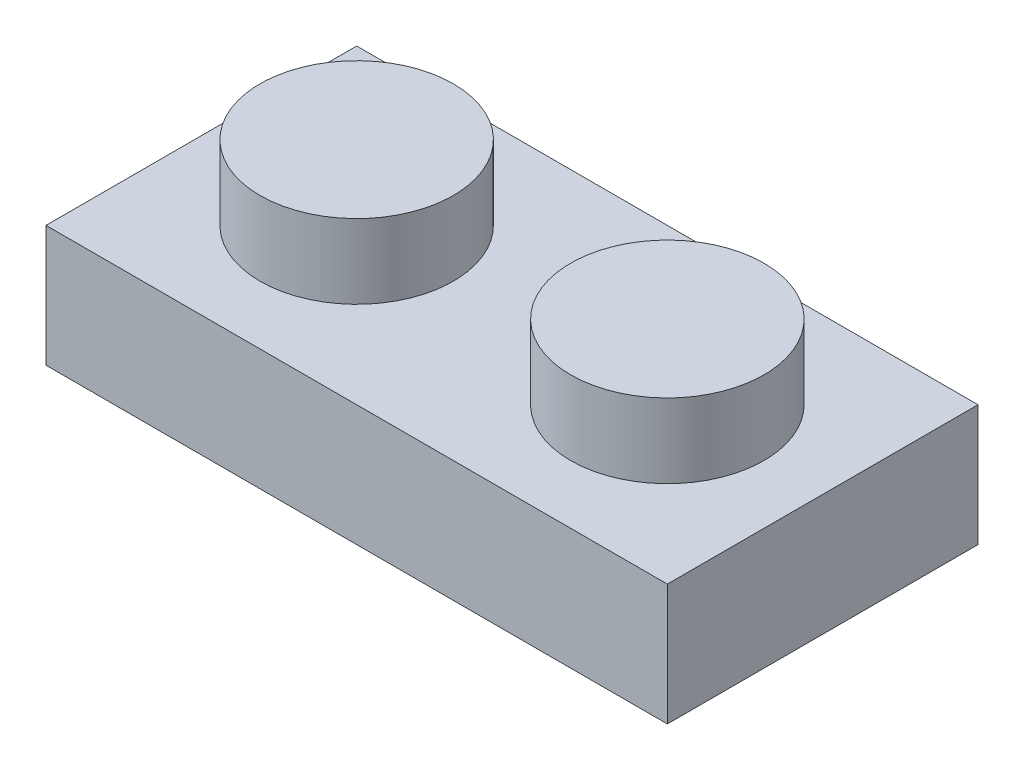
ISO-10303-21;
HEADER;
FILE_DESCRIPTION(('STEP AP214'),'2;1');
FILE_NAME('part.step','',(''),(''),'','','');
FILE_SCHEMA(('AUTOMOTIVE_DESIGN { 1 0 10303 214 1 1 1 1 }'));
ENDSEC;
DATA;
#1=APPLICATION_CONTEXT('core data for automotive mechanical design processes');
#2=APPLICATION_PROTOCOL_DEFINITION('international standard','automotive_design',2000,#1);
#3=PRODUCT_CONTEXT('',#1,'mechanical');
#4=PRODUCT('Part','Part','',(#3));
#5=PRODUCT_RELATED_PRODUCT_CATEGORY('part','',(#4));
#6=PRODUCT_DEFINITION_FORMATION('','',#4);
#7=PRODUCT_DEFINITION_CONTEXT('part definition',#1,'design');
#8=PRODUCT_DEFINITION('design','',#6,#7);
#9=PRODUCT_DEFINITION_SHAPE('','',#8);
#10=(LENGTH_UNIT() NAMED_UNIT(*) SI_UNIT(.MILLI.,.METRE.));
#11=(NAMED_UNIT(*) PLANE_ANGLE_UNIT() SI_UNIT($,.RADIAN.));
#12=(NAMED_UNIT(*) SI_UNIT($,.STERADIAN.) SOLID_ANGLE_UNIT());
#13=UNCERTAINTY_MEASURE_WITH_UNIT(LENGTH_MEASURE(1.E-05),#10,'distance_accuracy_value','');
#14=(GEOMETRIC_REPRESENTATION_CONTEXT(3) GLOBAL_UNCERTAINTY_ASSIGNED_CONTEXT((#13)) GLOBAL_UNIT_ASSIGNED_CONTEXT((#10,
#11,#12)) REPRESENTATION_CONTEXT('',''));
#15=CARTESIAN_POINT('',(0.,0.,0.));
#16=DIRECTION('',(0.,0.,1.));
#17=DIRECTION('',(1.,0.,0.));
#18=AXIS2_PLACEMENT_3D('',#15,#16,#17);
#19=CARTESIAN_POINT('',(-49.2534841215444,3.1,6.12242403472698));
#20=DIRECTION('',(0.,1.,0.));
#21=DIRECTION('',(0.,0.,1.));
#22=AXIS2_PLACEMENT_3D('',#19,#20,#21);
#23=PLANE('',#22);
#24=CARTESIAN_POINT('',(-45.2784841215445,3.1,10.097424034727));
#25=DIRECTION('',(0.,1.,0.));
#26=DIRECTION('',(0.,0.,1.));
#27=AXIS2_PLACEMENT_3D('',#24,#25,#26);
#28=CIRCLE('',#27,2.475);
#29=CARTESIAN_POINT('',(-45.2784841215445,3.1,7.62242403472699));
#30=VERTEX_POINT('',#29);
#31=EDGE_CURVE('E148',#30,#30,#28,.T.);
#32=ORIENTED_EDGE('',*,*,#31,.F.);
#33=EDGE_LOOP('',(#32));
#34=FACE_BOUND('',#33,.T.);
#35=DIRECTION('',(-1.,0.,0.));
#36=VECTOR('',#35,1.);
#37=CARTESIAN_POINT('',(-33.3534841215445,3.1,6.12242403472698));
#38=LINE('',#37,#36);
#39=CARTESIAN_POINT('',(-33.3534841215445,3.1,6.12242403472698));
#40=VERTEX_POINT('',#39);
#41=CARTESIAN_POINT('',(-49.2534841215444,3.1,6.12242403472698));
#42=VERTEX_POINT('',#41);
#43=EDGE_CURVE('E157',#40,#42,#38,.T.);
#44=ORIENTED_EDGE('',*,*,#43,.T.);
#45=DIRECTION('',(0.,0.,1.));
#46=VECTOR('',#45,1.);
#47=CARTESIAN_POINT('',(-49.2534841215444,3.1,6.12242403472698));
#48=LINE('',#47,#46);
#49=CARTESIAN_POINT('',(-49.2534841215445,3.1,14.072424034727));
#50=VERTEX_POINT('',#49);
#51=EDGE_CURVE('E84',#42,#50,#48,.T.);
#52=ORIENTED_EDGE('',*,*,#51,.T.);
#53=DIRECTION('',(1.,0.,0.));
#54=VECTOR('',#53,1.);
#55=CARTESIAN_POINT('',(-49.2534841215445,3.1,14.072424034727));
#56=LINE('',#55,#54);
#57=CARTESIAN_POINT('',(-33.3534841215445,3.1,14.072424034727));
#58=VERTEX_POINT('',#57);
#59=EDGE_CURVE('E160',#50,#58,#56,.T.);
#60=ORIENTED_EDGE('',*,*,#59,.T.);
#61=DIRECTION('',(0.,0.,-1.));
#62=VECTOR('',#61,1.);
#63=CARTESIAN_POINT('',(-33.3534841215445,3.1,14.072424034727));
#64=LINE('',#63,#62);
#65=EDGE_CURVE('E56',#58,#40,#64,.T.);
#66=ORIENTED_EDGE('',*,*,#65,.T.);
#67=EDGE_LOOP('',(#44,#52,#60,#66));
#68=FACE_BOUND('',#67,.T.);
#69=CARTESIAN_POINT('',(-37.3284841215445,3.1,10.097424034727));
#70=DIRECTION('',(0.,1.,0.));
#71=DIRECTION('',(0.,0.,1.));
#72=AXIS2_PLACEMENT_3D('',#69,#70,#71);
#73=CIRCLE('',#72,2.475);
#74=CARTESIAN_POINT('',(-37.3284841215445,3.1,7.62242403472699));
#75=VERTEX_POINT('',#74);
#76=EDGE_CURVE('E141',#75,#75,#73,.T.);
#77=ORIENTED_EDGE('',*,*,#76,.F.);
#78=EDGE_LOOP('',(#77));
#79=FACE_BOUND('',#78,.T.);
#80=ADVANCED_FACE('F32',(#34,#68,#79),#23,.T.);
#81=CARTESIAN_POINT('',(-33.3534841215445,3.1,6.12242403472698));
#82=DIRECTION('',(0.,0.,1.));
#83=DIRECTION('',(1.,0.,0.));
#84=AXIS2_PLACEMENT_3D('',#81,#82,#83);
#85=PLANE('',#84);
#86=DIRECTION('',(-1.,0.,0.));
#87=VECTOR('',#86,1.);
#88=CARTESIAN_POINT('',(-33.3534841215445,0.,6.12242403472698));
#89=LINE('',#88,#87);
#90=CARTESIAN_POINT('',(-33.3534841215445,0.,6.12242403472698));
#91=VERTEX_POINT('',#90);
#92=CARTESIAN_POINT('',(-49.2534841215444,0.,6.12242403472698));
#93=VERTEX_POINT('',#92);
#94=EDGE_CURVE('E154',#91,#93,#89,.T.);
#95=ORIENTED_EDGE('',*,*,#94,.T.);
#96=DIRECTION('',(0.,-1.,0.));
#97=VECTOR('',#96,1.);
#98=CARTESIAN_POINT('',(-49.2534841215444,3.1,6.12242403472698));
#99=LINE('',#98,#97);
#100=EDGE_CURVE('E11',#42,#93,#99,.T.);
#101=ORIENTED_EDGE('',*,*,#100,.F.);
#102=ORIENTED_EDGE('',*,*,#43,.F.);
#103=DIRECTION('',(0.,-1.,0.));
#104=VECTOR('',#103,1.);
#105=CARTESIAN_POINT('',(-33.3534841215445,3.1,6.12242403472698));
#106=LINE('',#105,#104);
#107=EDGE_CURVE('E163',#40,#91,#106,.T.);
#108=ORIENTED_EDGE('',*,*,#107,.T.);
#109=EDGE_LOOP('',(#95,#101,#102,#108));
#110=FACE_BOUND('',#109,.T.);
#111=ADVANCED_FACE('F34',(#110),#85,.F.);
#112=CARTESIAN_POINT('',(-49.2534841215444,3.1,6.12242403472698));
#113=DIRECTION('',(1.,0.,0.));
#114=DIRECTION('',(0.,0.,-1.));
#115=AXIS2_PLACEMENT_3D('',#112,#113,#114);
#116=PLANE('',#115);
#117=DIRECTION('',(0.,0.,1.));
#118=VECTOR('',#117,1.);
#119=CARTESIAN_POINT('',(-49.2534841215444,0.,6.12242403472698));
#120=LINE('',#119,#118);
#121=CARTESIAN_POINT('',(-49.2534841215445,0.,14.072424034727));
#122=VERTEX_POINT('',#121);
#123=EDGE_CURVE('E166',#93,#122,#120,.T.);
#124=ORIENTED_EDGE('',*,*,#123,.T.);
#125=DIRECTION('',(0.,-1.,0.));
#126=VECTOR('',#125,1.);
#127=CARTESIAN_POINT('',(-49.2534841215445,3.1,14.072424034727));
#128=LINE('',#127,#126);
#129=EDGE_CURVE('E40',#50,#122,#128,.T.);
#130=ORIENTED_EDGE('',*,*,#129,.F.);
#131=ORIENTED_EDGE('',*,*,#51,.F.);
#132=ORIENTED_EDGE('',*,*,#100,.T.);
#133=EDGE_LOOP('',(#124,#130,#131,#132));
#134=FACE_BOUND('',#133,.T.);
#135=ADVANCED_FACE('F195',(#134),#116,.F.);
#136=CARTESIAN_POINT('',(-49.2534841215445,3.1,14.072424034727));
#137=DIRECTION('',(0.,0.,-1.));
#138=DIRECTION('',(-1.,0.,0.));
#139=AXIS2_PLACEMENT_3D('',#136,#137,#138);
#140=PLANE('',#139);
#141=DIRECTION('',(1.,0.,0.));
#142=VECTOR('',#141,1.);
#143=CARTESIAN_POINT('',(-49.2534841215445,0.,14.072424034727));
#144=LINE('',#143,#142);
#145=CARTESIAN_POINT('',(-33.3534841215445,0.,14.072424034727));
#146=VERTEX_POINT('',#145);
#147=EDGE_CURVE('E168',#122,#146,#144,.T.);
#148=ORIENTED_EDGE('',*,*,#147,.T.);
#149=DIRECTION('',(0.,-1.,0.));
#150=VECTOR('',#149,1.);
#151=CARTESIAN_POINT('',(-33.3534841215445,3.1,14.072424034727));
#152=LINE('',#151,#150);
#153=EDGE_CURVE('E172',#58,#146,#152,.T.);
#154=ORIENTED_EDGE('',*,*,#153,.F.);
#155=ORIENTED_EDGE('',*,*,#59,.F.);
#156=ORIENTED_EDGE('',*,*,#129,.T.);
#157=EDGE_LOOP('',(#148,#154,#155,#156));
#158=FACE_BOUND('',#157,.T.);
#159=ADVANCED_FACE('F177',(#158),#140,.F.);
#160=CARTESIAN_POINT('',(-33.3534841215445,3.1,14.072424034727));
#161=DIRECTION('',(-1.,0.,0.));
#162=DIRECTION('',(0.,0.,1.));
#163=AXIS2_PLACEMENT_3D('',#160,#161,#162);
#164=PLANE('',#163);
#165=DIRECTION('',(0.,0.,-1.));
#166=VECTOR('',#165,1.);
#167=CARTESIAN_POINT('',(-33.3534841215445,0.,14.072424034727));
#168=LINE('',#167,#166);
#169=EDGE_CURVE('E77',#146,#91,#168,.T.);
#170=ORIENTED_EDGE('',*,*,#169,.T.);
#171=ORIENTED_EDGE('',*,*,#107,.F.);
#172=ORIENTED_EDGE('',*,*,#65,.F.);
#173=ORIENTED_EDGE('',*,*,#153,.T.);
#174=EDGE_LOOP('',(#170,#171,#172,#173));
#175=FACE_BOUND('',#174,.T.);
#176=ADVANCED_FACE('F185',(#175),#164,.F.);
#177=CARTESIAN_POINT('',(-49.2534841215444,0.,6.12242403472698));
#178=DIRECTION('',(0.,1.,0.));
#179=DIRECTION('',(0.,0.,1.));
#180=AXIS2_PLACEMENT_3D('',#177,#178,#179);
#181=PLANE('',#180);
#182=DIRECTION('',(1.,0.,0.));
#183=VECTOR('',#182,1.);
#184=CARTESIAN_POINT('',(-34.8534841215445,0.,7.62242403472698));
#185=LINE('',#184,#183);
#186=CARTESIAN_POINT('',(-47.7534841215444,0.,7.62242403472698));
#187=VERTEX_POINT('',#186);
#188=CARTESIAN_POINT('',(-34.8534841215445,0.,7.62242403472698));
#189=VERTEX_POINT('',#188);
#190=EDGE_CURVE('E135',#187,#189,#185,.T.);
#191=ORIENTED_EDGE('',*,*,#190,.F.);
#192=DIRECTION('',(0.,0.,-1.));
#193=VECTOR('',#192,1.);
#194=CARTESIAN_POINT('',(-47.7534841215444,0.,7.62242403472698));
#195=LINE('',#194,#193);
#196=CARTESIAN_POINT('',(-47.7534841215444,0.,12.572424034727));
#197=VERTEX_POINT('',#196);
#198=EDGE_CURVE('E47',#197,#187,#195,.T.);
#199=ORIENTED_EDGE('',*,*,#198,.F.);
#200=DIRECTION('',(-1.,0.,0.));
#201=VECTOR('',#200,1.);
#202=CARTESIAN_POINT('',(-47.7534841215444,0.,12.572424034727));
#203=LINE('',#202,#201);
#204=CARTESIAN_POINT('',(-34.8534841215445,0.,12.572424034727));
#205=VERTEX_POINT('',#204);
#206=EDGE_CURVE('E126',#205,#197,#203,.T.);
#207=ORIENTED_EDGE('',*,*,#206,.F.);
#208=DIRECTION('',(0.,0.,1.));
#209=VECTOR('',#208,1.);
#210=CARTESIAN_POINT('',(-34.8534841215445,0.,12.572424034727));
#211=LINE('',#210,#209);
#212=EDGE_CURVE('E129',#189,#205,#211,.T.);
#213=ORIENTED_EDGE('',*,*,#212,.F.);
#214=EDGE_LOOP('',(#191,#199,#207,#213));
#215=FACE_BOUND('',#214,.T.);
#216=ORIENTED_EDGE('',*,*,#94,.F.);
#217=ORIENTED_EDGE('',*,*,#169,.F.);
#218=ORIENTED_EDGE('',*,*,#147,.F.);
#219=ORIENTED_EDGE('',*,*,#123,.F.);
#220=EDGE_LOOP('',(#216,#217,#218,#219));
#221=FACE_BOUND('',#220,.T.);
#222=ADVANCED_FACE('F181',(#215,#221),#181,.F.);
#223=CARTESIAN_POINT('',(-45.2784841215445,5.,10.097424034727));
#224=DIRECTION('',(0.,-1.,0.));
#225=DIRECTION('',(0.,0.,-1.));
#226=AXIS2_PLACEMENT_3D('',#223,#224,#225);
#227=CYLINDRICAL_SURFACE('',#226,2.475);
#228=CARTESIAN_POINT('',(-45.2784841215445,5.,10.097424034727));
#229=DIRECTION('',(0.,1.,0.));
#230=DIRECTION('',(0.,0.,1.));
#231=AXIS2_PLACEMENT_3D('',#228,#229,#230);
#232=CIRCLE('',#231,2.475);
#233=CARTESIAN_POINT('',(-45.2784841215445,5.,7.62242403472699));
#234=VERTEX_POINT('',#233);
#235=EDGE_CURVE('E151',#234,#234,#232,.T.);
#236=CARTESIAN_POINT('',(-45.2784841215445,5.,7.62242403472699));
#237=CARTESIAN_POINT('',(-45.2784841215445,4.98020833333333,7.62242403472699));
#238=CARTESIAN_POINT('',(-45.2784841215445,4.96041666666667,7.62242403472699));
#239=CARTESIAN_POINT('',(-45.2784841215445,4.92083333333333,7.62242403472699));
#240=CARTESIAN_POINT('',(-45.2784841215445,4.90104166666667,7.62242403472699));
#241=CARTESIAN_POINT('',(-45.2784841215445,4.86145833333333,7.62242403472699));
#242=CARTESIAN_POINT('',(-45.2784841215445,4.84166666666667,7.62242403472699));
#243=CARTESIAN_POINT('',(-45.2784841215445,4.80208333333333,7.62242403472699));
#244=CARTESIAN_POINT('',(-45.2784841215445,4.78229166666667,7.62242403472699));
#245=CARTESIAN_POINT('',(-45.2784841215445,4.74270833333333,7.62242403472699));
#246=CARTESIAN_POINT('',(-45.2784841215445,4.72291666666667,7.62242403472699));
#247=CARTESIAN_POINT('',(-45.2784841215445,4.68333333333333,7.62242403472699));
#248=CARTESIAN_POINT('',(-45.2784841215445,4.66354166666667,7.62242403472699));
#249=CARTESIAN_POINT('',(-45.2784841215445,4.62395833333333,7.62242403472699));
#250=CARTESIAN_POINT('',(-45.2784841215445,4.60416666666667,7.62242403472699));
#251=CARTESIAN_POINT('',(-45.2784841215445,4.56458333333333,7.62242403472699));
#252=CARTESIAN_POINT('',(-45.2784841215445,4.54479166666667,7.62242403472699));
#253=CARTESIAN_POINT('',(-45.2784841215445,4.50520833333333,7.62242403472699));
#254=CARTESIAN_POINT('',(-45.2784841215445,4.48541666666667,7.62242403472699));
#255=CARTESIAN_POINT('',(-45.2784841215445,4.44583333333333,7.62242403472699));
#256=CARTESIAN_POINT('',(-45.2784841215445,4.42604166666667,7.62242403472699));
#257=CARTESIAN_POINT('',(-45.2784841215445,4.38645833333333,7.62242403472699));
#258=CARTESIAN_POINT('',(-45.2784841215445,4.36666666666667,7.62242403472699));
#259=CARTESIAN_POINT('',(-45.2784841215445,4.32708333333333,7.62242403472699));
#260=CARTESIAN_POINT('',(-45.2784841215445,4.30729166666667,7.62242403472699));
#261=CARTESIAN_POINT('',(-45.2784841215445,4.26770833333333,7.62242403472699));
#262=CARTESIAN_POINT('',(-45.2784841215445,4.24791666666667,7.62242403472699));
#263=CARTESIAN_POINT('',(-45.2784841215445,4.20833333333333,7.62242403472699));
#264=CARTESIAN_POINT('',(-45.2784841215445,4.18854166666667,7.62242403472699));
#265=CARTESIAN_POINT('',(-45.2784841215445,4.14895833333333,7.62242403472699));
#266=CARTESIAN_POINT('',(-45.2784841215445,4.12916666666667,7.62242403472699));
#267=CARTESIAN_POINT('',(-45.2784841215445,4.08958333333333,7.62242403472699));
#268=CARTESIAN_POINT('',(-45.2784841215445,4.06979166666667,7.62242403472699));
#269=CARTESIAN_POINT('',(-45.2784841215445,4.03020833333333,7.62242403472699));
#270=CARTESIAN_POINT('',(-45.2784841215445,4.01041666666667,7.62242403472699));
#271=CARTESIAN_POINT('',(-45.2784841215445,3.97083333333333,7.62242403472699));
#272=CARTESIAN_POINT('',(-45.2784841215445,3.95104166666667,7.62242403472699));
#273=CARTESIAN_POINT('',(-45.2784841215445,3.91145833333333,7.62242403472699));
#274=CARTESIAN_POINT('',(-45.2784841215445,3.89166666666667,7.62242403472699));
#275=CARTESIAN_POINT('',(-45.2784841215445,3.85208333333333,7.62242403472699));
#276=CARTESIAN_POINT('',(-45.2784841215445,3.83229166666667,7.62242403472699));
#277=CARTESIAN_POINT('',(-45.2784841215445,3.79270833333333,7.62242403472699));
#278=CARTESIAN_POINT('',(-45.2784841215445,3.77291666666667,7.62242403472699));
#279=CARTESIAN_POINT('',(-45.2784841215445,3.73333333333333,7.62242403472699));
#280=CARTESIAN_POINT('',(-45.2784841215445,3.71354166666667,7.62242403472699));
#281=CARTESIAN_POINT('',(-45.2784841215445,3.67395833333333,7.62242403472699));
#282=CARTESIAN_POINT('',(-45.2784841215445,3.65416666666667,7.62242403472699));
#283=CARTESIAN_POINT('',(-45.2784841215445,3.61458333333333,7.62242403472699));
#284=CARTESIAN_POINT('',(-45.2784841215445,3.59479166666667,7.62242403472699));
#285=CARTESIAN_POINT('',(-45.2784841215445,3.55520833333333,7.62242403472699));
#286=CARTESIAN_POINT('',(-45.2784841215445,3.53541666666667,7.62242403472699));
#287=CARTESIAN_POINT('',(-45.2784841215445,3.49583333333333,7.62242403472699));
#288=CARTESIAN_POINT('',(-45.2784841215445,3.47604166666667,7.62242403472699));
#289=CARTESIAN_POINT('',(-45.2784841215445,3.43645833333333,7.62242403472699));
#290=CARTESIAN_POINT('',(-45.2784841215445,3.41666666666667,7.62242403472699));
#291=CARTESIAN_POINT('',(-45.2784841215445,3.37708333333333,7.62242403472699));
#292=CARTESIAN_POINT('',(-45.2784841215445,3.35729166666667,7.62242403472699));
#293=CARTESIAN_POINT('',(-45.2784841215445,3.31770833333333,7.62242403472699));
#294=CARTESIAN_POINT('',(-45.2784841215445,3.29791666666667,7.62242403472699));
#295=CARTESIAN_POINT('',(-45.2784841215445,3.25833333333333,7.62242403472699));
#296=CARTESIAN_POINT('',(-45.2784841215445,3.23854166666667,7.62242403472699));
#297=CARTESIAN_POINT('',(-45.2784841215445,3.19895833333333,7.62242403472699));
#298=CARTESIAN_POINT('',(-45.2784841215445,3.17916666666667,7.62242403472699));
#299=CARTESIAN_POINT('',(-45.2784841215445,3.13958333333333,7.62242403472699));
#300=CARTESIAN_POINT('',(-45.2784841215445,3.11979166666667,7.62242403472699));
#301=CARTESIAN_POINT('',(-45.2784841215445,3.1,7.62242403472699));
#302=B_SPLINE_CURVE_WITH_KNOTS('',3,(#236,#237,#238,#239,#240,#241,#242,#243,#244,#245,#246,
#247,#248,#249,#250,#251,#252,#253,#254,#255,#256,#257,#258,#259,#260,#261,#262,#263,#264,#265,
#266,#267,#268,#269,#270,#271,#272,#273,#274,#275,#276,#277,#278,#279,#280,#281,#282,#283,#284,
#285,#286,#287,#288,#289,#290,#291,#292,#293,#294,#295,#296,#297,#298,#299,#300,#301),
.UNSPECIFIED.,.F.,.F.,(4,2,2,2,2,2,2,2,2,2,2,2,2,2,2,2,2,2,2,2,2,2,2,2,2,2,2,2,2,2,2,2,4),(0.,
0.0593750000000004,0.118750000000001,0.178125,0.237500000000001,0.296875,0.356250000000001,
0.415625,0.475000000000001,0.534375,0.593750000000001,0.653125,0.7125,0.771875000000001,0.83125,
0.890625000000001,0.95,1.009375,1.06875,1.128125,1.1875,1.246875,1.30625,1.365625,1.425,
1.484375,1.54375,1.603125,1.6625,1.721875,1.78125,1.840625,1.9),.UNSPECIFIED.);
#303=EDGE_CURVE('BSEAM192',#234,#30,#302,.T.);
#304=ORIENTED_EDGE('',*,*,#235,.F.);
#305=ORIENTED_EDGE('',*,*,#31,.T.);
#306=ORIENTED_EDGE('',*,*,#303,.T.);
#307=ORIENTED_EDGE('',*,*,#303,.F.);
#308=EDGE_LOOP('',(#304,#306,#305,#307));
#309=FACE_BOUND('',#308,.T.);
#310=ADVANCED_FACE('F192',(#309),#227,.T.);
#311=CARTESIAN_POINT('',(-45.2784841215445,5.,10.097424034727));
#312=DIRECTION('',(0.,1.,0.));
#313=DIRECTION('',(0.,0.,1.));
#314=AXIS2_PLACEMENT_3D('',#311,#312,#313);
#315=PLANE('',#314);
#316=ORIENTED_EDGE('',*,*,#235,.T.);
#317=EDGE_LOOP('',(#316));
#318=FACE_BOUND('',#317,.T.);
#319=ADVANCED_FACE('F207',(#318),#315,.T.);
#320=CARTESIAN_POINT('',(-37.3284841215445,5.,10.097424034727));
#321=DIRECTION('',(0.,-1.,0.));
#322=DIRECTION('',(0.,0.,-1.));
#323=AXIS2_PLACEMENT_3D('',#320,#321,#322);
#324=CYLINDRICAL_SURFACE('',#323,2.475);
#325=CARTESIAN_POINT('',(-37.3284841215445,5.,10.097424034727));
#326=DIRECTION('',(0.,1.,0.));
#327=DIRECTION('',(0.,0.,1.));
#328=AXIS2_PLACEMENT_3D('',#325,#326,#327);
#329=CIRCLE('',#328,2.475);
#330=CARTESIAN_POINT('',(-37.3284841215445,5.,7.62242403472699));
#331=VERTEX_POINT('',#330);
#332=EDGE_CURVE('E145',#331,#331,#329,.T.);
#333=CARTESIAN_POINT('',(-37.3284841215445,5.,7.62242403472699));
#334=CARTESIAN_POINT('',(-37.3284841215445,4.98020833333333,7.62242403472699));
#335=CARTESIAN_POINT('',(-37.3284841215445,4.96041666666667,7.62242403472699));
#336=CARTESIAN_POINT('',(-37.3284841215445,4.92083333333333,7.62242403472699));
#337=CARTESIAN_POINT('',(-37.3284841215445,4.90104166666667,7.62242403472699));
#338=CARTESIAN_POINT('',(-37.3284841215445,4.86145833333333,7.62242403472699));
#339=CARTESIAN_POINT('',(-37.3284841215445,4.84166666666667,7.62242403472699));
#340=CARTESIAN_POINT('',(-37.3284841215445,4.80208333333333,7.62242403472699));
#341=CARTESIAN_POINT('',(-37.3284841215445,4.78229166666667,7.62242403472699));
#342=CARTESIAN_POINT('',(-37.3284841215445,4.74270833333333,7.62242403472699));
#343=CARTESIAN_POINT('',(-37.3284841215445,4.72291666666667,7.62242403472699));
#344=CARTESIAN_POINT('',(-37.3284841215445,4.68333333333333,7.62242403472699));
#345=CARTESIAN_POINT('',(-37.3284841215445,4.66354166666667,7.62242403472699));
#346=CARTESIAN_POINT('',(-37.3284841215445,4.62395833333333,7.62242403472699));
#347=CARTESIAN_POINT('',(-37.3284841215445,4.60416666666667,7.62242403472699));
#348=CARTESIAN_POINT('',(-37.3284841215445,4.56458333333333,7.62242403472699));
#349=CARTESIAN_POINT('',(-37.3284841215445,4.54479166666667,7.62242403472699));
#350=CARTESIAN_POINT('',(-37.3284841215445,4.50520833333333,7.62242403472699));
#351=CARTESIAN_POINT('',(-37.3284841215445,4.48541666666667,7.62242403472699));
#352=CARTESIAN_POINT('',(-37.3284841215445,4.44583333333333,7.62242403472699));
#353=CARTESIAN_POINT('',(-37.3284841215445,4.42604166666667,7.62242403472699));
#354=CARTESIAN_POINT('',(-37.3284841215445,4.38645833333333,7.62242403472699));
#355=CARTESIAN_POINT('',(-37.3284841215445,4.36666666666667,7.62242403472699));
#356=CARTESIAN_POINT('',(-37.3284841215445,4.32708333333333,7.62242403472699));
#357=CARTESIAN_POINT('',(-37.3284841215445,4.30729166666667,7.62242403472699));
#358=CARTESIAN_POINT('',(-37.3284841215445,4.26770833333333,7.62242403472699));
#359=CARTESIAN_POINT('',(-37.3284841215445,4.24791666666667,7.62242403472699));
#360=CARTESIAN_POINT('',(-37.3284841215445,4.20833333333333,7.62242403472699));
#361=CARTESIAN_POINT('',(-37.3284841215445,4.18854166666667,7.62242403472699));
#362=CARTESIAN_POINT('',(-37.3284841215445,4.14895833333333,7.62242403472699));
#363=CARTESIAN_POINT('',(-37.3284841215445,4.12916666666667,7.62242403472699));
#364=CARTESIAN_POINT('',(-37.3284841215445,4.08958333333333,7.62242403472699));
#365=CARTESIAN_POINT('',(-37.3284841215445,4.06979166666667,7.62242403472699));
#366=CARTESIAN_POINT('',(-37.3284841215445,4.03020833333333,7.62242403472699));
#367=CARTESIAN_POINT('',(-37.3284841215445,4.01041666666667,7.62242403472699));
#368=CARTESIAN_POINT('',(-37.3284841215445,3.97083333333333,7.62242403472699));
#369=CARTESIAN_POINT('',(-37.3284841215445,3.95104166666667,7.62242403472699));
#370=CARTESIAN_POINT('',(-37.3284841215445,3.91145833333333,7.62242403472699));
#371=CARTESIAN_POINT('',(-37.3284841215445,3.89166666666667,7.62242403472699));
#372=CARTESIAN_POINT('',(-37.3284841215445,3.85208333333333,7.62242403472699));
#373=CARTESIAN_POINT('',(-37.3284841215445,3.83229166666667,7.62242403472699));
#374=CARTESIAN_POINT('',(-37.3284841215445,3.79270833333333,7.62242403472699));
#375=CARTESIAN_POINT('',(-37.3284841215445,3.77291666666667,7.62242403472699));
#376=CARTESIAN_POINT('',(-37.3284841215445,3.73333333333333,7.62242403472699));
#377=CARTESIAN_POINT('',(-37.3284841215445,3.71354166666667,7.62242403472699));
#378=CARTESIAN_POINT('',(-37.3284841215445,3.67395833333333,7.62242403472699));
#379=CARTESIAN_POINT('',(-37.3284841215445,3.65416666666667,7.62242403472699));
#380=CARTESIAN_POINT('',(-37.3284841215445,3.61458333333333,7.62242403472699));
#381=CARTESIAN_POINT('',(-37.3284841215445,3.59479166666667,7.62242403472699));
#382=CARTESIAN_POINT('',(-37.3284841215445,3.55520833333333,7.62242403472699));
#383=CARTESIAN_POINT('',(-37.3284841215445,3.53541666666667,7.62242403472699));
#384=CARTESIAN_POINT('',(-37.3284841215445,3.49583333333333,7.62242403472699));
#385=CARTESIAN_POINT('',(-37.3284841215445,3.47604166666667,7.62242403472699));
#386=CARTESIAN_POINT('',(-37.3284841215445,3.43645833333333,7.62242403472699));
#387=CARTESIAN_POINT('',(-37.3284841215445,3.41666666666667,7.62242403472699));
#388=CARTESIAN_POINT('',(-37.3284841215445,3.37708333333333,7.62242403472699));
#389=CARTESIAN_POINT('',(-37.3284841215445,3.35729166666667,7.62242403472699));
#390=CARTESIAN_POINT('',(-37.3284841215445,3.31770833333333,7.62242403472699));
#391=CARTESIAN_POINT('',(-37.3284841215445,3.29791666666667,7.62242403472699));
#392=CARTESIAN_POINT('',(-37.3284841215445,3.25833333333333,7.62242403472699));
#393=CARTESIAN_POINT('',(-37.3284841215445,3.23854166666667,7.62242403472699));
#394=CARTESIAN_POINT('',(-37.3284841215445,3.19895833333333,7.62242403472699));
#395=CARTESIAN_POINT('',(-37.3284841215445,3.17916666666667,7.62242403472699));
#396=CARTESIAN_POINT('',(-37.3284841215445,3.13958333333333,7.62242403472699));
#397=CARTESIAN_POINT('',(-37.3284841215445,3.11979166666667,7.62242403472699));
#398=CARTESIAN_POINT('',(-37.3284841215445,3.1,7.62242403472699));
#399=B_SPLINE_CURVE_WITH_KNOTS('',3,(#333,#334,#335,#336,#337,#338,#339,#340,#341,#342,#343,
#344,#345,#346,#347,#348,#349,#350,#351,#352,#353,#354,#355,#356,#357,#358,#359,#360,#361,#362,
#363,#364,#365,#366,#367,#368,#369,#370,#371,#372,#373,#374,#375,#376,#377,#378,#379,#380,#381,
#382,#383,#384,#385,#386,#387,#388,#389,#390,#391,#392,#393,#394,#395,#396,#397,#398),
.UNSPECIFIED.,.F.,.F.,(4,2,2,2,2,2,2,2,2,2,2,2,2,2,2,2,2,2,2,2,2,2,2,2,2,2,2,2,2,2,2,2,4),(0.,
0.0593750000000004,0.118750000000001,0.178125,0.237500000000001,0.296875,0.356250000000001,
0.415625,0.475000000000001,0.534375,0.593750000000001,0.653125,0.7125,0.771875000000001,0.83125,
0.890625000000001,0.95,1.009375,1.06875,1.128125,1.1875,1.246875,1.30625,1.365625,1.425,
1.484375,1.54375,1.603125,1.6625,1.721875,1.78125,1.840625,1.9),.UNSPECIFIED.);
#400=EDGE_CURVE('BSEAM211',#331,#75,#399,.T.);
#401=ORIENTED_EDGE('',*,*,#332,.F.);
#402=ORIENTED_EDGE('',*,*,#76,.T.);
#403=ORIENTED_EDGE('',*,*,#400,.T.);
#404=ORIENTED_EDGE('',*,*,#400,.F.);
#405=EDGE_LOOP('',(#401,#403,#402,#404));
#406=FACE_BOUND('',#405,.T.);
#407=ADVANCED_FACE('F211',(#406),#324,.T.);
#408=CARTESIAN_POINT('',(-37.3284841215445,5.,10.097424034727));
#409=DIRECTION('',(0.,1.,0.));
#410=DIRECTION('',(0.,0.,1.));
#411=AXIS2_PLACEMENT_3D('',#408,#409,#410);
#412=PLANE('',#411);
#413=ORIENTED_EDGE('',*,*,#332,.T.);
#414=EDGE_LOOP('',(#413));
#415=FACE_BOUND('',#414,.T.);
#416=ADVANCED_FACE('F215',(#415),#412,.T.);
#417=CARTESIAN_POINT('',(-47.7534841215444,2.,7.62242403472698));
#418=DIRECTION('',(-1.,0.,0.));
#419=DIRECTION('',(0.,0.,1.));
#420=AXIS2_PLACEMENT_3D('',#417,#418,#419);
#421=PLANE('',#420);
#422=ORIENTED_EDGE('',*,*,#198,.T.);
#423=DIRECTION('',(0.,-1.,0.));
#424=VECTOR('',#423,1.);
#425=CARTESIAN_POINT('',(-47.7534841215444,2.,7.62242403472698));
#426=LINE('',#425,#424);
#427=CARTESIAN_POINT('',(-47.7534841215444,2.,7.62242403472698));
#428=VERTEX_POINT('',#427);
#429=EDGE_CURVE('E104',#428,#187,#426,.T.);
#430=ORIENTED_EDGE('',*,*,#429,.F.);
#431=DIRECTION('',(0.,0.,-1.));
#432=VECTOR('',#431,1.);
#433=CARTESIAN_POINT('',(-47.7534841215444,2.,7.62242403472698));
#434=LINE('',#433,#432);
#435=CARTESIAN_POINT('',(-47.7534841215444,2.,12.572424034727));
#436=VERTEX_POINT('',#435);
#437=EDGE_CURVE('E108',#436,#428,#434,.T.);
#438=ORIENTED_EDGE('',*,*,#437,.F.);
#439=DIRECTION('',(0.,-1.,0.));
#440=VECTOR('',#439,1.);
#441=CARTESIAN_POINT('',(-47.7534841215444,2.,12.572424034727));
#442=LINE('',#441,#440);
#443=EDGE_CURVE('E139',#436,#197,#442,.T.);
#444=ORIENTED_EDGE('',*,*,#443,.T.);
#445=EDGE_LOOP('',(#422,#430,#438,#444));
#446=FACE_BOUND('',#445,.T.);
#447=ADVANCED_FACE('F106',(#446),#421,.F.);
#448=CARTESIAN_POINT('',(-47.7534841215444,2.,12.572424034727));
#449=DIRECTION('',(0.,0.,1.));
#450=DIRECTION('',(1.,0.,0.));
#451=AXIS2_PLACEMENT_3D('',#448,#449,#450);
#452=PLANE('',#451);
#453=ORIENTED_EDGE('',*,*,#206,.T.);
#454=ORIENTED_EDGE('',*,*,#443,.F.);
#455=DIRECTION('',(-1.,0.,0.));
#456=VECTOR('',#455,1.);
#457=CARTESIAN_POINT('',(-47.7534841215444,2.,12.572424034727));
#458=LINE('',#457,#456);
#459=CARTESIAN_POINT('',(-34.8534841215445,2.,12.572424034727));
#460=VERTEX_POINT('',#459);
#461=EDGE_CURVE('E114',#460,#436,#458,.T.);
#462=ORIENTED_EDGE('',*,*,#461,.F.);
#463=DIRECTION('',(0.,-1.,0.));
#464=VECTOR('',#463,1.);
#465=CARTESIAN_POINT('',(-34.8534841215445,2.,12.572424034727));
#466=LINE('',#465,#464);
#467=EDGE_CURVE('E142',#460,#205,#466,.T.);
#468=ORIENTED_EDGE('',*,*,#467,.T.);
#469=EDGE_LOOP('',(#453,#454,#462,#468));
#470=FACE_BOUND('',#469,.T.);
#471=ADVANCED_FACE('F222',(#470),#452,.F.);
#472=CARTESIAN_POINT('',(-34.8534841215445,2.,12.572424034727));
#473=DIRECTION('',(1.,0.,0.));
#474=DIRECTION('',(0.,0.,-1.));
#475=AXIS2_PLACEMENT_3D('',#472,#473,#474);
#476=PLANE('',#475);
#477=ORIENTED_EDGE('',*,*,#212,.T.);
#478=ORIENTED_EDGE('',*,*,#467,.F.);
#479=DIRECTION('',(0.,0.,1.));
#480=VECTOR('',#479,1.);
#481=CARTESIAN_POINT('',(-34.8534841215445,2.,12.572424034727));
#482=LINE('',#481,#480);
#483=CARTESIAN_POINT('',(-34.8534841215445,2.,7.62242403472698));
#484=VERTEX_POINT('',#483);
#485=EDGE_CURVE('E122',#484,#460,#482,.T.);
#486=ORIENTED_EDGE('',*,*,#485,.F.);
#487=DIRECTION('',(0.,-1.,0.));
#488=VECTOR('',#487,1.);
#489=CARTESIAN_POINT('',(-34.8534841215445,2.,7.62242403472698));
#490=LINE('',#489,#488);
#491=EDGE_CURVE('E113',#484,#189,#490,.T.);
#492=ORIENTED_EDGE('',*,*,#491,.T.);
#493=EDGE_LOOP('',(#477,#478,#486,#492));
#494=FACE_BOUND('',#493,.T.);
#495=ADVANCED_FACE('F225',(#494),#476,.F.);
#496=CARTESIAN_POINT('',(-34.8534841215445,2.,7.62242403472698));
#497=DIRECTION('',(0.,0.,-1.));
#498=DIRECTION('',(-1.,0.,0.));
#499=AXIS2_PLACEMENT_3D('',#496,#497,#498);
#500=PLANE('',#499);
#501=ORIENTED_EDGE('',*,*,#190,.T.);
#502=ORIENTED_EDGE('',*,*,#491,.F.);
#503=DIRECTION('',(1.,0.,0.));
#504=VECTOR('',#503,1.);
#505=CARTESIAN_POINT('',(-34.8534841215445,2.,7.62242403472698));
#506=LINE('',#505,#504);
#507=EDGE_CURVE('E117',#428,#484,#506,.T.);
#508=ORIENTED_EDGE('',*,*,#507,.F.);
#509=ORIENTED_EDGE('',*,*,#429,.T.);
#510=EDGE_LOOP('',(#501,#502,#508,#509));
#511=FACE_BOUND('',#510,.T.);
#512=ADVANCED_FACE('F118',(#511),#500,.F.);
#513=CARTESIAN_POINT('',(-47.7534841215444,2.,12.572424034727));
#514=DIRECTION('',(0.,1.,0.));
#515=DIRECTION('',(0.,0.,1.));
#516=AXIS2_PLACEMENT_3D('',#513,#514,#515);
#517=PLANE('',#516);
#518=ORIENTED_EDGE('',*,*,#437,.T.);
#519=ORIENTED_EDGE('',*,*,#507,.T.);
#520=ORIENTED_EDGE('',*,*,#485,.T.);
#521=ORIENTED_EDGE('',*,*,#461,.T.);
#522=EDGE_LOOP('',(#518,#519,#520,#521));
#523=FACE_BOUND('',#522,.T.);
#524=ADVANCED_FACE('F124',(#523),#517,.F.);
#525=CLOSED_SHELL('',(#80,#111,#135,#159,#176,#222,#310,#319,#407,#416,#447,#471,#495,#512,#524));
#526=MANIFOLD_SOLID_BREP('B2',#525);
#527=ADVANCED_BREP_SHAPE_REPRESENTATION('',(#18,#526),#14);
#528=SHAPE_DEFINITION_REPRESENTATION(#9,#527);
ENDSEC;
END-ISO-10303-21;
